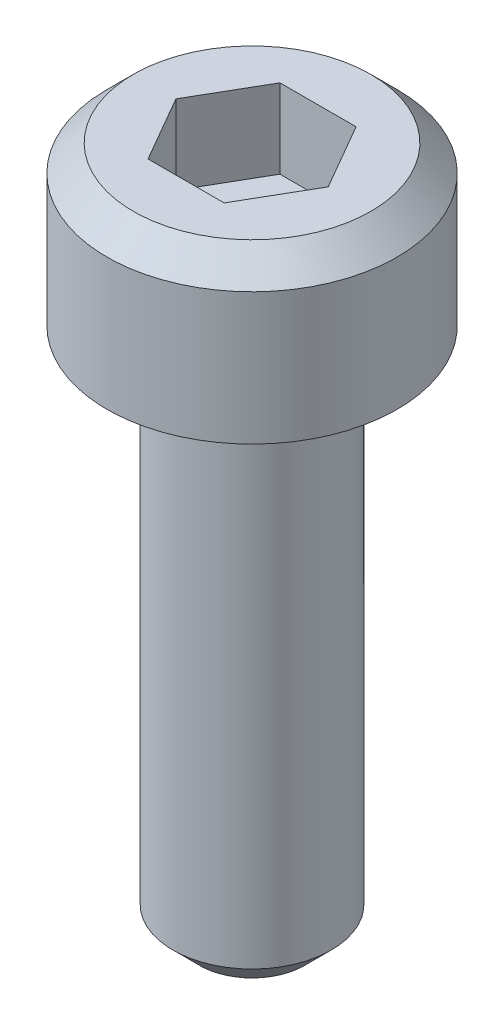
ISO-10303-21;
HEADER;
FILE_DESCRIPTION(('STEP AP214'),'2;1');
FILE_NAME('part.step','',(''),(''),'','','');
FILE_SCHEMA(('AUTOMOTIVE_DESIGN { 1 0 10303 214 1 1 1 1 }'));
ENDSEC;
DATA;
#1=APPLICATION_CONTEXT('core data for automotive mechanical design processes');
#2=APPLICATION_PROTOCOL_DEFINITION('international standard','automotive_design',2000,#1);
#3=PRODUCT_CONTEXT('',#1,'mechanical');
#4=PRODUCT('Part','Part','',(#3));
#5=PRODUCT_RELATED_PRODUCT_CATEGORY('part','',(#4));
#6=PRODUCT_DEFINITION_FORMATION('','',#4);
#7=PRODUCT_DEFINITION_CONTEXT('part definition',#1,'design');
#8=PRODUCT_DEFINITION('design','',#6,#7);
#9=PRODUCT_DEFINITION_SHAPE('','',#8);
#10=(LENGTH_UNIT() NAMED_UNIT(*) SI_UNIT(.MILLI.,.METRE.));
#11=(NAMED_UNIT(*) PLANE_ANGLE_UNIT() SI_UNIT($,.RADIAN.));
#12=(NAMED_UNIT(*) SI_UNIT($,.STERADIAN.) SOLID_ANGLE_UNIT());
#13=UNCERTAINTY_MEASURE_WITH_UNIT(LENGTH_MEASURE(1.E-05),#10,'distance_accuracy_value','');
#14=(GEOMETRIC_REPRESENTATION_CONTEXT(3) GLOBAL_UNCERTAINTY_ASSIGNED_CONTEXT((#13)) GLOBAL_UNIT_ASSIGNED_CONTEXT((#10,
#11,#12)) REPRESENTATION_CONTEXT('',''));
#15=CARTESIAN_POINT('',(0.,0.,0.));
#16=DIRECTION('',(0.,0.,1.));
#17=DIRECTION('',(1.,0.,0.));
#18=AXIS2_PLACEMENT_3D('',#15,#16,#17);
#19=CARTESIAN_POINT('',(0.,13.,0.));
#20=DIRECTION('',(0.,-1.,0.));
#21=DIRECTION('',(0.,0.,-1.));
#22=AXIS2_PLACEMENT_3D('',#19,#20,#21);
#23=PLANE('',#22);
#24=DIRECTION('',(0.5,0.,0.866025403784439));
#25=VECTOR('',#24,1.);
#26=CARTESIAN_POINT('',(-1.44337567297406,13.,0.));
#27=LINE('',#26,#25);
#28=CARTESIAN_POINT('',(-1.44337567297406,13.,0.));
#29=VERTEX_POINT('',#28);
#30=CARTESIAN_POINT('',(-0.721687836487033,13.,1.25));
#31=VERTEX_POINT('',#30);
#32=EDGE_CURVE('E124',#29,#31,#27,.T.);
#33=ORIENTED_EDGE('',*,*,#32,.F.);
#34=DIRECTION('',(-0.5,0.,0.866025403784439));
#35=VECTOR('',#34,1.);
#36=CARTESIAN_POINT('',(-0.721687836487032,13.,-1.25));
#37=LINE('',#36,#35);
#38=CARTESIAN_POINT('',(-0.721687836487032,13.,-1.25));
#39=VERTEX_POINT('',#38);
#40=EDGE_CURVE('E50',#39,#29,#37,.T.);
#41=ORIENTED_EDGE('',*,*,#40,.F.);
#42=DIRECTION('',(-1.,0.,0.));
#43=VECTOR('',#42,1.);
#44=CARTESIAN_POINT('',(0.721687836487032,13.,-1.25));
#45=LINE('',#44,#43);
#46=CARTESIAN_POINT('',(0.721687836487032,13.,-1.25));
#47=VERTEX_POINT('',#46);
#48=EDGE_CURVE('E133',#47,#39,#45,.T.);
#49=ORIENTED_EDGE('',*,*,#48,.F.);
#50=DIRECTION('',(-0.5,0.,-0.866025403784439));
#51=VECTOR('',#50,1.);
#52=CARTESIAN_POINT('',(1.44337567297406,13.,0.));
#53=LINE('',#52,#51);
#54=CARTESIAN_POINT('',(1.44337567297406,13.,0.));
#55=VERTEX_POINT('',#54);
#56=EDGE_CURVE('E131',#55,#47,#53,.T.);
#57=ORIENTED_EDGE('',*,*,#56,.F.);
#58=DIRECTION('',(0.5,0.,-0.866025403784439));
#59=VECTOR('',#58,1.);
#60=CARTESIAN_POINT('',(0.721687836487032,13.,1.25));
#61=LINE('',#60,#59);
#62=CARTESIAN_POINT('',(0.721687836487032,13.,1.25));
#63=VERTEX_POINT('',#62);
#64=EDGE_CURVE('E98',#63,#55,#61,.T.);
#65=ORIENTED_EDGE('',*,*,#64,.F.);
#66=DIRECTION('',(1.,0.,0.));
#67=VECTOR('',#66,1.);
#68=CARTESIAN_POINT('',(-0.721687836487033,13.,1.25));
#69=LINE('',#68,#67);
#70=EDGE_CURVE('E127',#31,#63,#69,.T.);
#71=ORIENTED_EDGE('',*,*,#70,.F.);
#72=EDGE_LOOP('',(#33,#41,#49,#57,#65,#71));
#73=FACE_BOUND('',#72,.T.);
#74=CARTESIAN_POINT('',(0.,13.,0.));
#75=DIRECTION('',(0.,-1.,0.));
#76=DIRECTION('',(0.,0.,-1.));
#77=AXIS2_PLACEMENT_3D('',#74,#75,#76);
#78=CIRCLE('',#77,2.25);
#79=CARTESIAN_POINT('',(0.,13.,-2.25));
#80=VERTEX_POINT('',#79);
#81=EDGE_CURVE('E11',#80,#80,#78,.T.);
#82=ORIENTED_EDGE('',*,*,#81,.F.);
#83=EDGE_LOOP('',(#82));
#84=FACE_BOUND('',#83,.T.);
#85=ADVANCED_FACE('F36',(#73,#84),#23,.F.);
#86=CARTESIAN_POINT('',(0.,13.,0.));
#87=DIRECTION('',(0.,-1.,0.));
#88=DIRECTION('',(0.,0.,-1.));
#89=AXIS2_PLACEMENT_3D('',#86,#87,#88);
#90=CONICAL_SURFACE('',#89,2.25,0.785398163397448);
#91=CARTESIAN_POINT('',(0.,12.5,0.));
#92=DIRECTION('',(0.,-1.,0.));
#93=DIRECTION('',(0.,0.,-1.));
#94=AXIS2_PLACEMENT_3D('',#91,#92,#93);
#95=CIRCLE('',#94,2.75);
#96=CARTESIAN_POINT('',(0.,12.5,-2.75));
#97=VERTEX_POINT('',#96);
#98=EDGE_CURVE('E43',#97,#97,#95,.T.);
#99=ORIENTED_EDGE('',*,*,#98,.F.);
#100=EDGE_LOOP('',(#99));
#101=FACE_BOUND('',#100,.T.);
#102=ORIENTED_EDGE('',*,*,#81,.T.);
#103=EDGE_LOOP('',(#102));
#104=FACE_BOUND('',#103,.T.);
#105=ADVANCED_FACE('F158',(#101,#104),#90,.T.);
#106=CARTESIAN_POINT('',(0.,0.,0.));
#107=DIRECTION('',(0.,-1.,0.));
#108=DIRECTION('',(0.,0.,-1.));
#109=AXIS2_PLACEMENT_3D('',#106,#107,#108);
#110=CYLINDRICAL_SURFACE('',#109,2.75);
#111=CARTESIAN_POINT('',(0.,10.,0.));
#112=DIRECTION('',(0.,-1.,0.));
#113=DIRECTION('',(0.,0.,-1.));
#114=AXIS2_PLACEMENT_3D('',#111,#112,#113);
#115=CIRCLE('',#114,2.75);
#116=CARTESIAN_POINT('',(0.,10.,-2.75));
#117=VERTEX_POINT('',#116);
#118=EDGE_CURVE('E151',#117,#117,#115,.T.);
#119=ORIENTED_EDGE('',*,*,#118,.F.);
#120=EDGE_LOOP('',(#119));
#121=FACE_BOUND('',#120,.T.);
#122=ORIENTED_EDGE('',*,*,#98,.T.);
#123=EDGE_LOOP('',(#122));
#124=FACE_BOUND('',#123,.T.);
#125=ADVANCED_FACE('F156',(#121,#124),#110,.T.);
#126=CARTESIAN_POINT('',(-2.75,10.,0.));
#127=DIRECTION('',(0.,1.,0.));
#128=DIRECTION('',(0.,0.,1.));
#129=AXIS2_PLACEMENT_3D('',#126,#127,#128);
#130=PLANE('',#129);
#131=CARTESIAN_POINT('',(0.,10.,0.));
#132=DIRECTION('',(0.,-1.,0.));
#133=DIRECTION('',(0.,0.,-1.));
#134=AXIS2_PLACEMENT_3D('',#131,#132,#133);
#135=CIRCLE('',#134,1.5);
#136=CARTESIAN_POINT('',(0.,10.,-1.5));
#137=VERTEX_POINT('',#136);
#138=EDGE_CURVE('E148',#137,#137,#135,.T.);
#139=ORIENTED_EDGE('',*,*,#138,.F.);
#140=EDGE_LOOP('',(#139));
#141=FACE_BOUND('',#140,.T.);
#142=ORIENTED_EDGE('',*,*,#118,.T.);
#143=EDGE_LOOP('',(#142));
#144=FACE_BOUND('',#143,.T.);
#145=ADVANCED_FACE('F195',(#141,#144),#130,.F.);
#146=CARTESIAN_POINT('',(0.,0.,0.));
#147=DIRECTION('',(0.,-1.,0.));
#148=DIRECTION('',(0.,0.,-1.));
#149=AXIS2_PLACEMENT_3D('',#146,#147,#148);
#150=CYLINDRICAL_SURFACE('',#149,1.5);
#151=CARTESIAN_POINT('',(0.,0.5,0.));
#152=DIRECTION('',(0.,-1.,0.));
#153=DIRECTION('',(0.,0.,-1.));
#154=AXIS2_PLACEMENT_3D('',#151,#152,#153);
#155=CIRCLE('',#154,1.5);
#156=CARTESIAN_POINT('',(0.,0.5,-1.5));
#157=VERTEX_POINT('',#156);
#158=EDGE_CURVE('E145',#157,#157,#155,.T.);
#159=ORIENTED_EDGE('',*,*,#158,.F.);
#160=EDGE_LOOP('',(#159));
#161=FACE_BOUND('',#160,.T.);
#162=ORIENTED_EDGE('',*,*,#138,.T.);
#163=EDGE_LOOP('',(#162));
#164=FACE_BOUND('',#163,.T.);
#165=ADVANCED_FACE('F191',(#161,#164),#150,.T.);
#166=CARTESIAN_POINT('',(0.,0.5,0.));
#167=DIRECTION('',(0.,1.,0.));
#168=DIRECTION('',(0.,0.,1.));
#169=AXIS2_PLACEMENT_3D('',#166,#167,#168);
#170=CONICAL_SURFACE('',#169,1.5,0.785398163397448);
#171=CARTESIAN_POINT('',(0.,0.,0.));
#172=DIRECTION('',(0.,-1.,0.));
#173=DIRECTION('',(0.,0.,-1.));
#174=AXIS2_PLACEMENT_3D('',#171,#172,#173);
#175=CIRCLE('',#174,0.999999999999999);
#176=CARTESIAN_POINT('',(0.,0.,-0.999999999999999));
#177=VERTEX_POINT('',#176);
#178=EDGE_CURVE('E137',#177,#177,#175,.T.);
#179=ORIENTED_EDGE('',*,*,#178,.F.);
#180=EDGE_LOOP('',(#179));
#181=FACE_BOUND('',#180,.T.);
#182=ORIENTED_EDGE('',*,*,#158,.T.);
#183=EDGE_LOOP('',(#182));
#184=FACE_BOUND('',#183,.T.);
#185=ADVANCED_FACE('F183',(#181,#184),#170,.T.);
#186=CARTESIAN_POINT('',(-0.999999999999999,0.,0.));
#187=DIRECTION('',(0.,1.,0.));
#188=DIRECTION('',(0.,0.,1.));
#189=AXIS2_PLACEMENT_3D('',#186,#187,#188);
#190=PLANE('',#189);
#191=ORIENTED_EDGE('',*,*,#178,.T.);
#192=EDGE_LOOP('',(#191));
#193=FACE_BOUND('',#192,.T.);
#194=ADVANCED_FACE('F176',(#193),#190,.F.);
#195=CARTESIAN_POINT('',(-0.721687836487032,11.5,-1.25));
#196=DIRECTION('',(-0.866025403784439,0.,-0.5));
#197=DIRECTION('',(-0.5,0.,0.866025403784439));
#198=AXIS2_PLACEMENT_3D('',#195,#196,#197);
#199=PLANE('',#198);
#200=ORIENTED_EDGE('',*,*,#40,.T.);
#201=DIRECTION('',(0.,1.,0.));
#202=VECTOR('',#201,1.);
#203=CARTESIAN_POINT('',(-1.44337567297406,11.5,0.));
#204=LINE('',#203,#202);
#205=CARTESIAN_POINT('',(-1.44337567297406,11.5,0.));
#206=VERTEX_POINT('',#205);
#207=EDGE_CURVE('E80',#206,#29,#204,.T.);
#208=ORIENTED_EDGE('',*,*,#207,.F.);
#209=DIRECTION('',(-0.5,0.,0.866025403784439));
#210=VECTOR('',#209,1.);
#211=CARTESIAN_POINT('',(-0.721687836487032,11.5,-1.25));
#212=LINE('',#211,#210);
#213=CARTESIAN_POINT('',(-0.721687836487032,11.5,-1.25));
#214=VERTEX_POINT('',#213);
#215=EDGE_CURVE('E135',#214,#206,#212,.T.);
#216=ORIENTED_EDGE('',*,*,#215,.F.);
#217=DIRECTION('',(0.,1.,0.));
#218=VECTOR('',#217,1.);
#219=CARTESIAN_POINT('',(-0.721687836487032,11.5,-1.25));
#220=LINE('',#219,#218);
#221=EDGE_CURVE('E58',#214,#39,#220,.T.);
#222=ORIENTED_EDGE('',*,*,#221,.T.);
#223=EDGE_LOOP('',(#200,#208,#216,#222));
#224=FACE_BOUND('',#223,.T.);
#225=ADVANCED_FACE('F173',(#224),#199,.F.);
#226=CARTESIAN_POINT('',(0.721687836487032,11.5,-1.25));
#227=DIRECTION('',(0.,0.,-1.));
#228=DIRECTION('',(-1.,0.,0.));
#229=AXIS2_PLACEMENT_3D('',#226,#227,#228);
#230=PLANE('',#229);
#231=ORIENTED_EDGE('',*,*,#48,.T.);
#232=ORIENTED_EDGE('',*,*,#221,.F.);
#233=DIRECTION('',(-1.,0.,0.));
#234=VECTOR('',#233,1.);
#235=CARTESIAN_POINT('',(0.721687836487032,11.5,-1.25));
#236=LINE('',#235,#234);
#237=CARTESIAN_POINT('',(0.721687836487032,11.5,-1.25));
#238=VERTEX_POINT('',#237);
#239=EDGE_CURVE('E110',#238,#214,#236,.T.);
#240=ORIENTED_EDGE('',*,*,#239,.F.);
#241=DIRECTION('',(0.,1.,0.));
#242=VECTOR('',#241,1.);
#243=CARTESIAN_POINT('',(0.721687836487032,11.5,-1.25));
#244=LINE('',#243,#242);
#245=EDGE_CURVE('E102',#238,#47,#244,.T.);
#246=ORIENTED_EDGE('',*,*,#245,.T.);
#247=EDGE_LOOP('',(#231,#232,#240,#246));
#248=FACE_BOUND('',#247,.T.);
#249=ADVANCED_FACE('F175',(#248),#230,.F.);
#250=CARTESIAN_POINT('',(1.44337567297406,11.5,0.));
#251=DIRECTION('',(0.866025403784439,0.,-0.5));
#252=DIRECTION('',(-0.5,0.,-0.866025403784439));
#253=AXIS2_PLACEMENT_3D('',#250,#251,#252);
#254=PLANE('',#253);
#255=ORIENTED_EDGE('',*,*,#56,.T.);
#256=ORIENTED_EDGE('',*,*,#245,.F.);
#257=DIRECTION('',(-0.5,0.,-0.866025403784439));
#258=VECTOR('',#257,1.);
#259=CARTESIAN_POINT('',(1.44337567297406,11.5,0.));
#260=LINE('',#259,#258);
#261=CARTESIAN_POINT('',(1.44337567297406,11.5,0.));
#262=VERTEX_POINT('',#261);
#263=EDGE_CURVE('E106',#262,#238,#260,.T.);
#264=ORIENTED_EDGE('',*,*,#263,.F.);
#265=DIRECTION('',(0.,1.,0.));
#266=VECTOR('',#265,1.);
#267=CARTESIAN_POINT('',(1.44337567297406,11.5,0.));
#268=LINE('',#267,#266);
#269=EDGE_CURVE('E91',#262,#55,#268,.T.);
#270=ORIENTED_EDGE('',*,*,#269,.T.);
#271=EDGE_LOOP('',(#255,#256,#264,#270));
#272=FACE_BOUND('',#271,.T.);
#273=ADVANCED_FACE('F107',(#272),#254,.F.);
#274=CARTESIAN_POINT('',(0.721687836487032,11.5,1.25));
#275=DIRECTION('',(0.866025403784439,0.,0.5));
#276=DIRECTION('',(0.5,0.,-0.866025403784439));
#277=AXIS2_PLACEMENT_3D('',#274,#275,#276);
#278=PLANE('',#277);
#279=ORIENTED_EDGE('',*,*,#64,.T.);
#280=ORIENTED_EDGE('',*,*,#269,.F.);
#281=DIRECTION('',(0.5,0.,-0.866025403784439));
#282=VECTOR('',#281,1.);
#283=CARTESIAN_POINT('',(0.721687836487032,11.5,1.25));
#284=LINE('',#283,#282);
#285=CARTESIAN_POINT('',(0.721687836487032,11.5,1.25));
#286=VERTEX_POINT('',#285);
#287=EDGE_CURVE('E95',#286,#262,#284,.T.);
#288=ORIENTED_EDGE('',*,*,#287,.F.);
#289=DIRECTION('',(0.,1.,0.));
#290=VECTOR('',#289,1.);
#291=CARTESIAN_POINT('',(0.721687836487032,11.5,1.25));
#292=LINE('',#291,#290);
#293=EDGE_CURVE('E103',#286,#63,#292,.T.);
#294=ORIENTED_EDGE('',*,*,#293,.T.);
#295=EDGE_LOOP('',(#279,#280,#288,#294));
#296=FACE_BOUND('',#295,.T.);
#297=ADVANCED_FACE('F93',(#296),#278,.F.);
#298=CARTESIAN_POINT('',(-0.721687836487033,11.5,1.25));
#299=DIRECTION('',(0.,0.,1.));
#300=DIRECTION('',(1.,0.,0.));
#301=AXIS2_PLACEMENT_3D('',#298,#299,#300);
#302=PLANE('',#301);
#303=ORIENTED_EDGE('',*,*,#70,.T.);
#304=ORIENTED_EDGE('',*,*,#293,.F.);
#305=DIRECTION('',(1.,0.,0.));
#306=VECTOR('',#305,1.);
#307=CARTESIAN_POINT('',(-0.721687836487033,11.5,1.25));
#308=LINE('',#307,#306);
#309=CARTESIAN_POINT('',(-0.721687836487033,11.5,1.25));
#310=VERTEX_POINT('',#309);
#311=EDGE_CURVE('E116',#310,#286,#308,.T.);
#312=ORIENTED_EDGE('',*,*,#311,.F.);
#313=DIRECTION('',(0.,1.,0.));
#314=VECTOR('',#313,1.);
#315=CARTESIAN_POINT('',(-0.721687836487033,11.5,1.25));
#316=LINE('',#315,#314);
#317=EDGE_CURVE('E140',#310,#31,#316,.T.);
#318=ORIENTED_EDGE('',*,*,#317,.T.);
#319=EDGE_LOOP('',(#303,#304,#312,#318));
#320=FACE_BOUND('',#319,.T.);
#321=ADVANCED_FACE('F261',(#320),#302,.F.);
#322=CARTESIAN_POINT('',(-1.44337567297406,11.5,0.));
#323=DIRECTION('',(-0.866025403784439,0.,0.5));
#324=DIRECTION('',(0.5,0.,0.866025403784439));
#325=AXIS2_PLACEMENT_3D('',#322,#323,#324);
#326=PLANE('',#325);
#327=ORIENTED_EDGE('',*,*,#32,.T.);
#328=ORIENTED_EDGE('',*,*,#317,.F.);
#329=DIRECTION('',(0.5,0.,0.866025403784439));
#330=VECTOR('',#329,1.);
#331=CARTESIAN_POINT('',(-1.44337567297406,11.5,0.));
#332=LINE('',#331,#330);
#333=EDGE_CURVE('E118',#206,#310,#332,.T.);
#334=ORIENTED_EDGE('',*,*,#333,.F.);
#335=ORIENTED_EDGE('',*,*,#207,.T.);
#336=EDGE_LOOP('',(#327,#328,#334,#335));
#337=FACE_BOUND('',#336,.T.);
#338=ADVANCED_FACE('F171',(#337),#326,.F.);
#339=CARTESIAN_POINT('',(0.,11.5,0.));
#340=DIRECTION('',(0.,1.,0.));
#341=DIRECTION('',(0.,0.,1.));
#342=AXIS2_PLACEMENT_3D('',#339,#340,#341);
#343=PLANE('',#342);
#344=ORIENTED_EDGE('',*,*,#215,.T.);
#345=ORIENTED_EDGE('',*,*,#333,.T.);
#346=ORIENTED_EDGE('',*,*,#311,.T.);
#347=ORIENTED_EDGE('',*,*,#287,.T.);
#348=ORIENTED_EDGE('',*,*,#263,.T.);
#349=ORIENTED_EDGE('',*,*,#239,.T.);
#350=EDGE_LOOP('',(#344,#345,#346,#347,#348,#349));
#351=FACE_BOUND('',#350,.T.);
#352=ADVANCED_FACE('F113',(#351),#343,.T.);
#353=CLOSED_SHELL('',(#85,#105,#125,#145,#165,#185,#194,#225,#249,#273,#297,#321,#338,#352));
#354=MANIFOLD_SOLID_BREP('B2',#353);
#355=ADVANCED_BREP_SHAPE_REPRESENTATION('',(#18,#354),#14);
#356=SHAPE_DEFINITION_REPRESENTATION(#9,#355);
ENDSEC;
END-ISO-10303-21;
